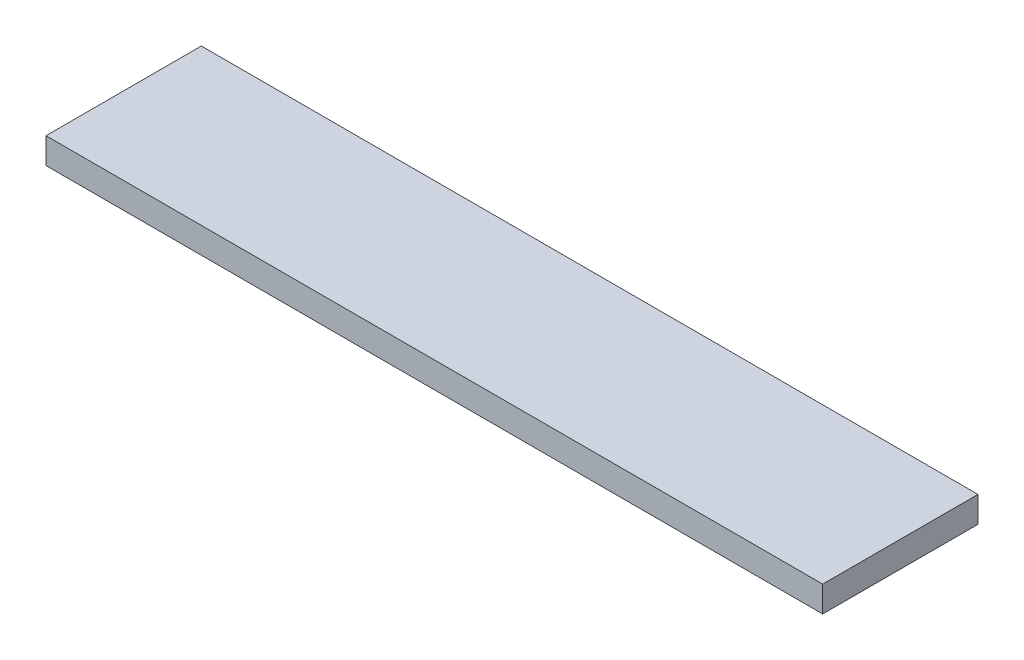
ISO-10303-21;
HEADER;
FILE_DESCRIPTION(('STEP AP214'),'2;1');
FILE_NAME('part.step','',(''),(''),'','','');
FILE_SCHEMA(('AUTOMOTIVE_DESIGN { 1 0 10303 214 1 1 1 1 }'));
ENDSEC;
DATA;
#1=APPLICATION_CONTEXT('core data for automotive mechanical design processes');
#2=APPLICATION_PROTOCOL_DEFINITION('international standard','automotive_design',2000,#1);
#3=PRODUCT_CONTEXT('',#1,'mechanical');
#4=PRODUCT('Part','Part','',(#3));
#5=PRODUCT_RELATED_PRODUCT_CATEGORY('part','',(#4));
#6=PRODUCT_DEFINITION_FORMATION('','',#4);
#7=PRODUCT_DEFINITION_CONTEXT('part definition',#1,'design');
#8=PRODUCT_DEFINITION('design','',#6,#7);
#9=PRODUCT_DEFINITION_SHAPE('','',#8);
#10=(LENGTH_UNIT() NAMED_UNIT(*) SI_UNIT(.MILLI.,.METRE.));
#11=(NAMED_UNIT(*) PLANE_ANGLE_UNIT() SI_UNIT($,.RADIAN.));
#12=(NAMED_UNIT(*) SI_UNIT($,.STERADIAN.) SOLID_ANGLE_UNIT());
#13=UNCERTAINTY_MEASURE_WITH_UNIT(LENGTH_MEASURE(1.E-05),#10,'distance_accuracy_value','');
#14=(GEOMETRIC_REPRESENTATION_CONTEXT(3) GLOBAL_UNCERTAINTY_ASSIGNED_CONTEXT((#13)) GLOBAL_UNIT_ASSIGNED_CONTEXT((#10,
#11,#12)) REPRESENTATION_CONTEXT('',''));
#15=CARTESIAN_POINT('',(0.,0.,0.));
#16=DIRECTION('',(0.,0.,1.));
#17=DIRECTION('',(1.,0.,0.));
#18=AXIS2_PLACEMENT_3D('',#15,#16,#17);
#19=CARTESIAN_POINT('',(150.,10.,30.));
#20=DIRECTION('',(-1.,0.,0.));
#21=DIRECTION('',(0.,0.,1.));
#22=AXIS2_PLACEMENT_3D('',#19,#20,#21);
#23=PLANE('',#22);
#24=DIRECTION('',(0.,0.,-1.));
#25=VECTOR('',#24,1.);
#26=CARTESIAN_POINT('',(150.,0.,30.));
#27=LINE('',#26,#25);
#28=CARTESIAN_POINT('',(150.,0.,30.));
#29=VERTEX_POINT('',#28);
#30=CARTESIAN_POINT('',(150.,0.,-30.));
#31=VERTEX_POINT('',#30);
#32=EDGE_CURVE('E99',#29,#31,#27,.T.);
#33=ORIENTED_EDGE('',*,*,#32,.T.);
#34=DIRECTION('',(0.,-1.,0.));
#35=VECTOR('',#34,1.);
#36=CARTESIAN_POINT('',(150.,10.,-30.));
#37=LINE('',#36,#35);
#38=CARTESIAN_POINT('',(150.,10.,-30.));
#39=VERTEX_POINT('',#38);
#40=EDGE_CURVE('E11',#39,#31,#37,.T.);
#41=ORIENTED_EDGE('',*,*,#40,.F.);
#42=DIRECTION('',(0.,0.,-1.));
#43=VECTOR('',#42,1.);
#44=CARTESIAN_POINT('',(150.,10.,30.));
#45=LINE('',#44,#43);
#46=CARTESIAN_POINT('',(150.,10.,30.));
#47=VERTEX_POINT('',#46);
#48=EDGE_CURVE('E87',#47,#39,#45,.T.);
#49=ORIENTED_EDGE('',*,*,#48,.F.);
#50=DIRECTION('',(0.,-1.,0.));
#51=VECTOR('',#50,1.);
#52=CARTESIAN_POINT('',(150.,10.,30.));
#53=LINE('',#52,#51);
#54=EDGE_CURVE('E95',#47,#29,#53,.T.);
#55=ORIENTED_EDGE('',*,*,#54,.T.);
#56=EDGE_LOOP('',(#33,#41,#49,#55));
#57=FACE_BOUND('',#56,.T.);
#58=ADVANCED_FACE('F36',(#57),#23,.F.);
#59=CARTESIAN_POINT('',(-150.,10.,-30.));
#60=DIRECTION('',(0.,0.,1.));
#61=DIRECTION('',(1.,0.,0.));
#62=AXIS2_PLACEMENT_3D('',#59,#60,#61);
#63=PLANE('',#62);
#64=DIRECTION('',(-1.,0.,0.));
#65=VECTOR('',#64,1.);
#66=CARTESIAN_POINT('',(-150.,0.,-30.));
#67=LINE('',#66,#65);
#68=CARTESIAN_POINT('',(-150.,0.,-30.));
#69=VERTEX_POINT('',#68);
#70=EDGE_CURVE('E91',#31,#69,#67,.T.);
#71=ORIENTED_EDGE('',*,*,#70,.T.);
#72=DIRECTION('',(0.,-1.,0.));
#73=VECTOR('',#72,1.);
#74=CARTESIAN_POINT('',(-150.,10.,-30.));
#75=LINE('',#74,#73);
#76=CARTESIAN_POINT('',(-150.,10.,-30.));
#77=VERTEX_POINT('',#76);
#78=EDGE_CURVE('E44',#77,#69,#75,.T.);
#79=ORIENTED_EDGE('',*,*,#78,.F.);
#80=DIRECTION('',(-1.,0.,0.));
#81=VECTOR('',#80,1.);
#82=CARTESIAN_POINT('',(-150.,10.,-30.));
#83=LINE('',#82,#81);
#84=EDGE_CURVE('E82',#39,#77,#83,.T.);
#85=ORIENTED_EDGE('',*,*,#84,.F.);
#86=ORIENTED_EDGE('',*,*,#40,.T.);
#87=EDGE_LOOP('',(#71,#79,#85,#86));
#88=FACE_BOUND('',#87,.T.);
#89=ADVANCED_FACE('F90',(#88),#63,.F.);
#90=CARTESIAN_POINT('',(-150.,10.,30.));
#91=DIRECTION('',(1.,0.,0.));
#92=DIRECTION('',(0.,0.,-1.));
#93=AXIS2_PLACEMENT_3D('',#90,#91,#92);
#94=PLANE('',#93);
#95=DIRECTION('',(0.,0.,1.));
#96=VECTOR('',#95,1.);
#97=CARTESIAN_POINT('',(-150.,0.,30.));
#98=LINE('',#97,#96);
#99=CARTESIAN_POINT('',(-150.,0.,30.));
#100=VERTEX_POINT('',#99);
#101=EDGE_CURVE('E69',#69,#100,#98,.T.);
#102=ORIENTED_EDGE('',*,*,#101,.T.);
#103=DIRECTION('',(0.,-1.,0.));
#104=VECTOR('',#103,1.);
#105=CARTESIAN_POINT('',(-150.,10.,30.));
#106=LINE('',#105,#104);
#107=CARTESIAN_POINT('',(-150.,10.,30.));
#108=VERTEX_POINT('',#107);
#109=EDGE_CURVE('E92',#108,#100,#106,.T.);
#110=ORIENTED_EDGE('',*,*,#109,.F.);
#111=DIRECTION('',(0.,0.,1.));
#112=VECTOR('',#111,1.);
#113=CARTESIAN_POINT('',(-150.,10.,30.));
#114=LINE('',#113,#112);
#115=EDGE_CURVE('E85',#77,#108,#114,.T.);
#116=ORIENTED_EDGE('',*,*,#115,.F.);
#117=ORIENTED_EDGE('',*,*,#78,.T.);
#118=EDGE_LOOP('',(#102,#110,#116,#117));
#119=FACE_BOUND('',#118,.T.);
#120=ADVANCED_FACE('F93',(#119),#94,.F.);
#121=CARTESIAN_POINT('',(-150.,10.,30.));
#122=DIRECTION('',(0.,0.,-1.));
#123=DIRECTION('',(-1.,0.,0.));
#124=AXIS2_PLACEMENT_3D('',#121,#122,#123);
#125=PLANE('',#124);
#126=DIRECTION('',(1.,0.,0.));
#127=VECTOR('',#126,1.);
#128=CARTESIAN_POINT('',(-150.,0.,30.));
#129=LINE('',#128,#127);
#130=EDGE_CURVE('E75',#100,#29,#129,.T.);
#131=ORIENTED_EDGE('',*,*,#130,.T.);
#132=ORIENTED_EDGE('',*,*,#54,.F.);
#133=DIRECTION('',(1.,0.,0.));
#134=VECTOR('',#133,1.);
#135=CARTESIAN_POINT('',(-150.,10.,30.));
#136=LINE('',#135,#134);
#137=EDGE_CURVE('E52',#108,#47,#136,.T.);
#138=ORIENTED_EDGE('',*,*,#137,.F.);
#139=ORIENTED_EDGE('',*,*,#109,.T.);
#140=EDGE_LOOP('',(#131,#132,#138,#139));
#141=FACE_BOUND('',#140,.T.);
#142=ADVANCED_FACE('F106',(#141),#125,.F.);
#143=CARTESIAN_POINT('',(0.,10.,0.));
#144=DIRECTION('',(0.,-1.,0.));
#145=DIRECTION('',(0.,0.,-1.));
#146=AXIS2_PLACEMENT_3D('',#143,#144,#145);
#147=PLANE('',#146);
#148=ORIENTED_EDGE('',*,*,#48,.T.);
#149=ORIENTED_EDGE('',*,*,#84,.T.);
#150=ORIENTED_EDGE('',*,*,#115,.T.);
#151=ORIENTED_EDGE('',*,*,#137,.T.);
#152=EDGE_LOOP('',(#148,#149,#150,#151));
#153=FACE_BOUND('',#152,.T.);
#154=ADVANCED_FACE('F83',(#153),#147,.F.);
#155=CARTESIAN_POINT('',(0.,0.,0.));
#156=DIRECTION('',(0.,-1.,0.));
#157=DIRECTION('',(0.,0.,-1.));
#158=AXIS2_PLACEMENT_3D('',#155,#156,#157);
#159=PLANE('',#158);
#160=ORIENTED_EDGE('',*,*,#32,.F.);
#161=ORIENTED_EDGE('',*,*,#130,.F.);
#162=ORIENTED_EDGE('',*,*,#101,.F.);
#163=ORIENTED_EDGE('',*,*,#70,.F.);
#164=EDGE_LOOP('',(#160,#161,#162,#163));
#165=FACE_BOUND('',#164,.T.);
#166=ADVANCED_FACE('F109',(#165),#159,.T.);
#167=CLOSED_SHELL('',(#58,#89,#120,#142,#154,#166));
#168=MANIFOLD_SOLID_BREP('B2',#167);
#169=ADVANCED_BREP_SHAPE_REPRESENTATION('',(#18,#168),#14);
#170=SHAPE_DEFINITION_REPRESENTATION(#9,#169);
ENDSEC;
END-ISO-10303-21;
